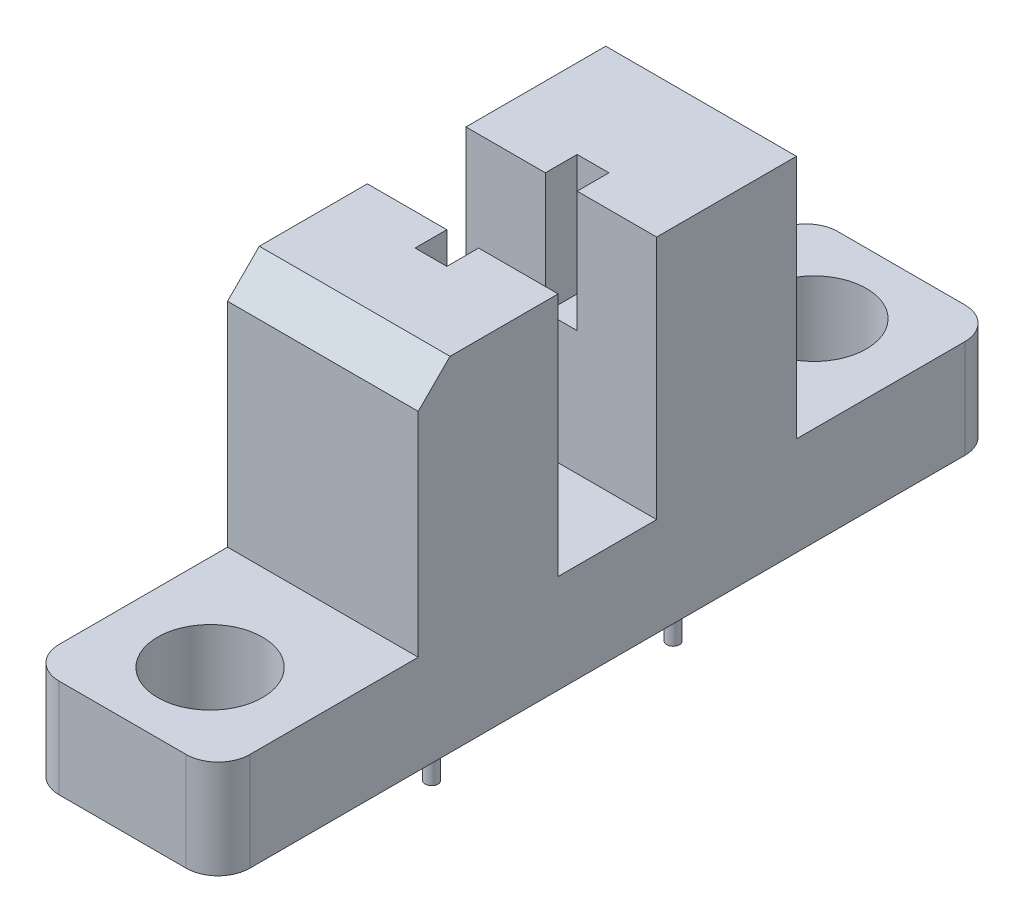
ISO-10303-21;
HEADER;
FILE_DESCRIPTION(('STEP AP214'),'2;1');
FILE_NAME('part.step','',(''),(''),'','','');
FILE_SCHEMA(('AUTOMOTIVE_DESIGN { 1 0 10303 214 1 1 1 1 }'));
ENDSEC;
DATA;
#1=APPLICATION_CONTEXT('core data for automotive mechanical design processes');
#2=APPLICATION_PROTOCOL_DEFINITION('international standard','automotive_design',2000,#1);
#3=PRODUCT_CONTEXT('',#1,'mechanical');
#4=PRODUCT('Part','Part','',(#3));
#5=PRODUCT_RELATED_PRODUCT_CATEGORY('part','',(#4));
#6=PRODUCT_DEFINITION_FORMATION('','',#4);
#7=PRODUCT_DEFINITION_CONTEXT('part definition',#1,'design');
#8=PRODUCT_DEFINITION('design','',#6,#7);
#9=PRODUCT_DEFINITION_SHAPE('','',#8);
#10=(LENGTH_UNIT() NAMED_UNIT(*) SI_UNIT(.MILLI.,.METRE.));
#11=(NAMED_UNIT(*) PLANE_ANGLE_UNIT() SI_UNIT($,.RADIAN.));
#12=(NAMED_UNIT(*) SI_UNIT($,.STERADIAN.) SOLID_ANGLE_UNIT());
#13=UNCERTAINTY_MEASURE_WITH_UNIT(LENGTH_MEASURE(1.E-05),#10,'distance_accuracy_value','');
#14=(GEOMETRIC_REPRESENTATION_CONTEXT(3) GLOBAL_UNCERTAINTY_ASSIGNED_CONTEXT((#13)) GLOBAL_UNIT_ASSIGNED_CONTEXT((#10,
#11,#12)) REPRESENTATION_CONTEXT('',''));
#15=CARTESIAN_POINT('',(0.,0.,0.));
#16=DIRECTION('',(0.,0.,1.));
#17=DIRECTION('',(1.,0.,0.));
#18=AXIS2_PLACEMENT_3D('',#15,#16,#17);
#19=CARTESIAN_POINT('',(3.,-1.55,12.25));
#20=DIRECTION('',(0.,1.,0.));
#21=DIRECTION('',(0.,0.,1.));
#22=AXIS2_PLACEMENT_3D('',#19,#20,#21);
#23=PLANE('',#22);
#24=CARTESIAN_POINT('',(-1.27,-1.55,-3.8));
#25=DIRECTION('',(0.,1.,0.));
#26=DIRECTION('',(0.,0.,1.));
#27=AXIS2_PLACEMENT_3D('',#24,#25,#26);
#28=CIRCLE('',#27,0.2);
#29=CARTESIAN_POINT('',(-1.27,-1.55,-3.6));
#30=VERTEX_POINT('',#29);
#31=EDGE_CURVE('E11',#30,#30,#28,.F.);
#32=ORIENTED_EDGE('',*,*,#31,.F.);
#33=EDGE_LOOP('',(#32));
#34=FACE_BOUND('',#33,.T.);
#35=CARTESIAN_POINT('',(1.27,-1.55,-3.8));
#36=DIRECTION('',(0.,1.,0.));
#37=DIRECTION('',(0.,0.,1.));
#38=AXIS2_PLACEMENT_3D('',#35,#36,#37);
#39=CIRCLE('',#38,0.2);
#40=CARTESIAN_POINT('',(1.27,-1.55,-3.6));
#41=VERTEX_POINT('',#40);
#42=EDGE_CURVE('E46',#41,#41,#39,.F.);
#43=ORIENTED_EDGE('',*,*,#42,.F.);
#44=EDGE_LOOP('',(#43));
#45=FACE_BOUND('',#44,.T.);
#46=CARTESIAN_POINT('',(1.27,-1.55,3.8));
#47=DIRECTION('',(0.,1.,0.));
#48=DIRECTION('',(0.,0.,1.));
#49=AXIS2_PLACEMENT_3D('',#46,#47,#48);
#50=CIRCLE('',#49,0.2);
#51=CARTESIAN_POINT('',(1.27,-1.55,4.));
#52=VERTEX_POINT('',#51);
#53=EDGE_CURVE('E471',#52,#52,#50,.F.);
#54=ORIENTED_EDGE('',*,*,#53,.F.);
#55=EDGE_LOOP('',(#54));
#56=FACE_BOUND('',#55,.T.);
#57=CARTESIAN_POINT('',(-1.27,-1.55,3.8));
#58=DIRECTION('',(0.,1.,0.));
#59=DIRECTION('',(0.,0.,1.));
#60=AXIS2_PLACEMENT_3D('',#57,#58,#59);
#61=CIRCLE('',#60,0.2);
#62=CARTESIAN_POINT('',(-1.27,-1.55,4.));
#63=VERTEX_POINT('',#62);
#64=EDGE_CURVE('E467',#63,#63,#61,.F.);
#65=ORIENTED_EDGE('',*,*,#64,.F.);
#66=EDGE_LOOP('',(#65));
#67=FACE_BOUND('',#66,.T.);
#68=CARTESIAN_POINT('',(0.,-1.55,-9.5));
#69=DIRECTION('',(0.,1.,0.));
#70=DIRECTION('',(0.,0.,1.));
#71=AXIS2_PLACEMENT_3D('',#68,#69,#70);
#72=CIRCLE('',#71,1.65);
#73=CARTESIAN_POINT('',(0.,-1.55,-7.85));
#74=VERTEX_POINT('',#73);
#75=EDGE_CURVE('E288',#74,#74,#72,.F.);
#76=ORIENTED_EDGE('',*,*,#75,.F.);
#77=EDGE_LOOP('',(#76));
#78=FACE_BOUND('',#77,.T.);
#79=CARTESIAN_POINT('',(2.,-1.55,-11.25));
#80=DIRECTION('',(0.,1.,0.));
#81=DIRECTION('',(0.,0.,1.));
#82=AXIS2_PLACEMENT_3D('',#79,#80,#81);
#83=CIRCLE('',#82,1.);
#84=CARTESIAN_POINT('',(2.,-1.55,-12.25));
#85=VERTEX_POINT('',#84);
#86=CARTESIAN_POINT('',(3.,-1.55,-11.25));
#87=VERTEX_POINT('',#86);
#88=EDGE_CURVE('E432',#85,#87,#83,.F.);
#89=ORIENTED_EDGE('',*,*,#88,.T.);
#90=DIRECTION('',(0.,0.,-1.));
#91=VECTOR('',#90,1.);
#92=CARTESIAN_POINT('',(3.,-1.55,12.25));
#93=LINE('',#92,#91);
#94=CARTESIAN_POINT('',(3.,-1.55,11.25));
#95=VERTEX_POINT('',#94);
#96=EDGE_CURVE('E365',#95,#87,#93,.T.);
#97=ORIENTED_EDGE('',*,*,#96,.F.);
#98=CARTESIAN_POINT('',(2.,-1.55,11.25));
#99=DIRECTION('',(0.,1.,0.));
#100=DIRECTION('',(0.,0.,1.));
#101=AXIS2_PLACEMENT_3D('',#98,#99,#100);
#102=CIRCLE('',#101,1.);
#103=CARTESIAN_POINT('',(2.,-1.55,12.25));
#104=VERTEX_POINT('',#103);
#105=EDGE_CURVE('E426',#95,#104,#102,.F.);
#106=ORIENTED_EDGE('',*,*,#105,.T.);
#107=DIRECTION('',(-1.,0.,0.));
#108=VECTOR('',#107,1.);
#109=CARTESIAN_POINT('',(3.,-1.55,12.25));
#110=LINE('',#109,#108);
#111=CARTESIAN_POINT('',(-2.,-1.55,12.25));
#112=VERTEX_POINT('',#111);
#113=EDGE_CURVE('E374',#104,#112,#110,.T.);
#114=ORIENTED_EDGE('',*,*,#113,.T.);
#115=CARTESIAN_POINT('',(-2.,-1.55,11.25));
#116=DIRECTION('',(0.,1.,0.));
#117=DIRECTION('',(0.,0.,1.));
#118=AXIS2_PLACEMENT_3D('',#115,#116,#117);
#119=CIRCLE('',#118,1.);
#120=CARTESIAN_POINT('',(-3.,-1.55,11.25));
#121=VERTEX_POINT('',#120);
#122=EDGE_CURVE('E429',#112,#121,#119,.F.);
#123=ORIENTED_EDGE('',*,*,#122,.T.);
#124=DIRECTION('',(0.,0.,-1.));
#125=VECTOR('',#124,1.);
#126=CARTESIAN_POINT('',(-3.,-1.55,12.25));
#127=LINE('',#126,#125);
#128=CARTESIAN_POINT('',(-3.,-1.55,-11.25));
#129=VERTEX_POINT('',#128);
#130=EDGE_CURVE('E364',#121,#129,#127,.T.);
#131=ORIENTED_EDGE('',*,*,#130,.T.);
#132=CARTESIAN_POINT('',(-2.,-1.55,-11.25));
#133=DIRECTION('',(0.,1.,0.));
#134=DIRECTION('',(0.,0.,1.));
#135=AXIS2_PLACEMENT_3D('',#132,#133,#134);
#136=CIRCLE('',#135,1.);
#137=CARTESIAN_POINT('',(-2.,-1.55,-12.25));
#138=VERTEX_POINT('',#137);
#139=EDGE_CURVE('E436',#129,#138,#136,.F.);
#140=ORIENTED_EDGE('',*,*,#139,.T.);
#141=DIRECTION('',(-1.,0.,0.));
#142=VECTOR('',#141,1.);
#143=CARTESIAN_POINT('',(3.,-1.55,-12.25));
#144=LINE('',#143,#142);
#145=EDGE_CURVE('E394',#85,#138,#144,.T.);
#146=ORIENTED_EDGE('',*,*,#145,.F.);
#147=EDGE_LOOP('',(#89,#97,#106,#114,#123,#131,#140,#146));
#148=FACE_BOUND('',#147,.T.);
#149=CARTESIAN_POINT('',(0.,-1.55,9.5));
#150=DIRECTION('',(0.,1.,0.));
#151=DIRECTION('',(0.,0.,1.));
#152=AXIS2_PLACEMENT_3D('',#149,#150,#151);
#153=CIRCLE('',#152,1.65);
#154=CARTESIAN_POINT('',(0.,-1.55,11.15));
#155=VERTEX_POINT('',#154);
#156=EDGE_CURVE('E284',#155,#155,#153,.T.);
#157=ORIENTED_EDGE('',*,*,#156,.T.);
#158=EDGE_LOOP('',(#157));
#159=FACE_BOUND('',#158,.T.);
#160=ADVANCED_FACE('F37',(#34,#45,#56,#67,#78,#148,#159),#23,.F.);
#161=CARTESIAN_POINT('',(3.,1.55,12.25));
#162=DIRECTION('',(0.,-1.,0.));
#163=DIRECTION('',(0.,0.,-1.));
#164=AXIS2_PLACEMENT_3D('',#161,#162,#163);
#165=PLANE('',#164);
#166=CARTESIAN_POINT('',(0.,1.55,9.5));
#167=DIRECTION('',(0.,1.,0.));
#168=DIRECTION('',(0.,0.,1.));
#169=AXIS2_PLACEMENT_3D('',#166,#167,#168);
#170=CIRCLE('',#169,1.65);
#171=CARTESIAN_POINT('',(0.,1.55,11.15));
#172=VERTEX_POINT('',#171);
#173=EDGE_CURVE('E279',#172,#172,#170,.F.);
#174=ORIENTED_EDGE('',*,*,#173,.T.);
#175=EDGE_LOOP('',(#174));
#176=FACE_BOUND('',#175,.T.);
#177=DIRECTION('',(1.,0.,0.));
#178=VECTOR('',#177,1.);
#179=CARTESIAN_POINT('',(3.,1.55,5.95));
#180=LINE('',#179,#178);
#181=CARTESIAN_POINT('',(-3.,1.55,5.95));
#182=VERTEX_POINT('',#181);
#183=CARTESIAN_POINT('',(3.,1.55,5.95));
#184=VERTEX_POINT('',#183);
#185=EDGE_CURVE('E314',#182,#184,#180,.T.);
#186=ORIENTED_EDGE('',*,*,#185,.F.);
#187=DIRECTION('',(0.,0.,1.));
#188=VECTOR('',#187,1.);
#189=CARTESIAN_POINT('',(-3.,1.55,12.25));
#190=LINE('',#189,#188);
#191=CARTESIAN_POINT('',(-3.,1.55,11.25));
#192=VERTEX_POINT('',#191);
#193=EDGE_CURVE('E378',#182,#192,#190,.T.);
#194=ORIENTED_EDGE('',*,*,#193,.T.);
#195=CARTESIAN_POINT('',(-2.,1.55,11.25));
#196=DIRECTION('',(0.,-1.,0.));
#197=DIRECTION('',(0.,0.,-1.));
#198=AXIS2_PLACEMENT_3D('',#195,#196,#197);
#199=CIRCLE('',#198,1.);
#200=CARTESIAN_POINT('',(-2.,1.55,12.25));
#201=VERTEX_POINT('',#200);
#202=EDGE_CURVE('E409',#192,#201,#199,.F.);
#203=ORIENTED_EDGE('',*,*,#202,.T.);
#204=DIRECTION('',(-1.,0.,0.));
#205=VECTOR('',#204,1.);
#206=CARTESIAN_POINT('',(3.,1.55,12.25));
#207=LINE('',#206,#205);
#208=CARTESIAN_POINT('',(2.,1.55,12.25));
#209=VERTEX_POINT('',#208);
#210=EDGE_CURVE('E386',#209,#201,#207,.T.);
#211=ORIENTED_EDGE('',*,*,#210,.F.);
#212=CARTESIAN_POINT('',(2.,1.55,11.25));
#213=DIRECTION('',(0.,-1.,0.));
#214=DIRECTION('',(0.,0.,-1.));
#215=AXIS2_PLACEMENT_3D('',#212,#213,#214);
#216=CIRCLE('',#215,1.);
#217=CARTESIAN_POINT('',(3.,1.55,11.25));
#218=VERTEX_POINT('',#217);
#219=EDGE_CURVE('E405',#209,#218,#216,.F.);
#220=ORIENTED_EDGE('',*,*,#219,.T.);
#221=DIRECTION('',(0.,0.,1.));
#222=VECTOR('',#221,1.);
#223=CARTESIAN_POINT('',(3.,1.55,12.25));
#224=LINE('',#223,#222);
#225=EDGE_CURVE('E368',#184,#218,#224,.T.);
#226=ORIENTED_EDGE('',*,*,#225,.F.);
#227=EDGE_LOOP('',(#186,#194,#203,#211,#220,#226));
#228=FACE_BOUND('',#227,.T.);
#229=ADVANCED_FACE('F483',(#176,#228),#165,.F.);
#230=CARTESIAN_POINT('',(-3.,1.55,-1.55));
#231=VERTEX_POINT('',#230);
#232=CARTESIAN_POINT('',(-3.,1.55,1.55));
#233=VERTEX_POINT('',#232);
#234=EDGE_CURVE('E382',#231,#233,#190,.T.);
#235=ORIENTED_EDGE('',*,*,#234,.T.);
#236=DIRECTION('',(1.,0.,0.));
#237=VECTOR('',#236,1.);
#238=CARTESIAN_POINT('',(3.,1.55,1.55));
#239=LINE('',#238,#237);
#240=CARTESIAN_POINT('',(3.,1.55,1.55));
#241=VERTEX_POINT('',#240);
#242=EDGE_CURVE('E326',#233,#241,#239,.T.);
#243=ORIENTED_EDGE('',*,*,#242,.T.);
#244=CARTESIAN_POINT('',(3.,1.55,-1.55));
#245=VERTEX_POINT('',#244);
#246=EDGE_CURVE('E375',#245,#241,#224,.T.);
#247=ORIENTED_EDGE('',*,*,#246,.F.);
#248=DIRECTION('',(1.,0.,0.));
#249=VECTOR('',#248,1.);
#250=CARTESIAN_POINT('',(3.,1.55,-1.55));
#251=LINE('',#250,#249);
#252=EDGE_CURVE('E348',#231,#245,#251,.T.);
#253=ORIENTED_EDGE('',*,*,#252,.F.);
#254=EDGE_LOOP('',(#235,#243,#247,#253));
#255=FACE_BOUND('',#254,.T.);
#256=ADVANCED_FACE('F557',(#255),#165,.F.);
#257=CARTESIAN_POINT('',(3.,1.55,-12.25));
#258=DIRECTION('',(0.,0.,1.));
#259=DIRECTION('',(1.,0.,0.));
#260=AXIS2_PLACEMENT_3D('',#257,#258,#259);
#261=PLANE('',#260);
#262=ORIENTED_EDGE('',*,*,#145,.T.);
#263=DIRECTION('',(0.,1.,0.));
#264=VECTOR('',#263,1.);
#265=CARTESIAN_POINT('',(-2.,1.55,-12.25));
#266=LINE('',#265,#264);
#267=CARTESIAN_POINT('',(-2.,1.55,-12.25));
#268=VERTEX_POINT('',#267);
#269=EDGE_CURVE('E401',#138,#268,#266,.T.);
#270=ORIENTED_EDGE('',*,*,#269,.T.);
#271=DIRECTION('',(-1.,0.,0.));
#272=VECTOR('',#271,1.);
#273=CARTESIAN_POINT('',(3.,1.55,-12.25));
#274=LINE('',#273,#272);
#275=CARTESIAN_POINT('',(2.,1.55,-12.25));
#276=VERTEX_POINT('',#275);
#277=EDGE_CURVE('E390',#276,#268,#274,.T.);
#278=ORIENTED_EDGE('',*,*,#277,.F.);
#279=DIRECTION('',(0.,1.,0.));
#280=VECTOR('',#279,1.);
#281=CARTESIAN_POINT('',(2.,1.55,-12.25));
#282=LINE('',#281,#280);
#283=EDGE_CURVE('E398',#276,#85,#282,.F.);
#284=ORIENTED_EDGE('',*,*,#283,.T.);
#285=EDGE_LOOP('',(#262,#270,#278,#284));
#286=FACE_BOUND('',#285,.T.);
#287=ADVANCED_FACE('F555',(#286),#261,.F.);
#288=CARTESIAN_POINT('',(0.,1.55,-9.5));
#289=DIRECTION('',(0.,1.,0.));
#290=DIRECTION('',(0.,0.,1.));
#291=AXIS2_PLACEMENT_3D('',#288,#289,#290);
#292=CIRCLE('',#291,1.65);
#293=CARTESIAN_POINT('',(0.,1.55,-7.85));
#294=VERTEX_POINT('',#293);
#295=EDGE_CURVE('E289',#294,#294,#292,.T.);
#296=ORIENTED_EDGE('',*,*,#295,.F.);
#297=EDGE_LOOP('',(#296));
#298=FACE_BOUND('',#297,.T.);
#299=CARTESIAN_POINT('',(-3.,1.55,-11.25));
#300=VERTEX_POINT('',#299);
#301=CARTESIAN_POINT('',(-3.,1.55,-5.95));
#302=VERTEX_POINT('',#301);
#303=EDGE_CURVE('E369',#300,#302,#190,.T.);
#304=ORIENTED_EDGE('',*,*,#303,.T.);
#305=DIRECTION('',(1.,0.,0.));
#306=VECTOR('',#305,1.);
#307=CARTESIAN_POINT('',(3.,1.55,-5.95));
#308=LINE('',#307,#306);
#309=CARTESIAN_POINT('',(3.,1.55,-5.95));
#310=VERTEX_POINT('',#309);
#311=EDGE_CURVE('E360',#302,#310,#308,.T.);
#312=ORIENTED_EDGE('',*,*,#311,.T.);
#313=CARTESIAN_POINT('',(3.,1.55,-11.25));
#314=VERTEX_POINT('',#313);
#315=EDGE_CURVE('E370',#314,#310,#224,.T.);
#316=ORIENTED_EDGE('',*,*,#315,.F.);
#317=CARTESIAN_POINT('',(2.,1.55,-11.25));
#318=DIRECTION('',(0.,-1.,0.));
#319=DIRECTION('',(0.,0.,-1.));
#320=AXIS2_PLACEMENT_3D('',#317,#318,#319);
#321=CIRCLE('',#320,1.);
#322=EDGE_CURVE('E412',#314,#276,#321,.F.);
#323=ORIENTED_EDGE('',*,*,#322,.T.);
#324=ORIENTED_EDGE('',*,*,#277,.T.);
#325=CARTESIAN_POINT('',(-2.,1.55,-11.25));
#326=DIRECTION('',(0.,-1.,0.));
#327=DIRECTION('',(0.,0.,-1.));
#328=AXIS2_PLACEMENT_3D('',#325,#326,#327);
#329=CIRCLE('',#328,1.);
#330=EDGE_CURVE('E415',#268,#300,#329,.F.);
#331=ORIENTED_EDGE('',*,*,#330,.T.);
#332=EDGE_LOOP('',(#304,#312,#316,#323,#324,#331));
#333=FACE_BOUND('',#332,.T.);
#334=ADVANCED_FACE('F551',(#298,#333),#165,.F.);
#335=CARTESIAN_POINT('',(3.,1.55,12.25));
#336=DIRECTION('',(0.,0.,-1.));
#337=DIRECTION('',(-1.,0.,0.));
#338=AXIS2_PLACEMENT_3D('',#335,#336,#337);
#339=PLANE('',#338);
#340=ORIENTED_EDGE('',*,*,#210,.T.);
#341=DIRECTION('',(0.,-1.,0.));
#342=VECTOR('',#341,1.);
#343=CARTESIAN_POINT('',(-2.,-1.55,12.25));
#344=LINE('',#343,#342);
#345=EDGE_CURVE('E450',#201,#112,#344,.T.);
#346=ORIENTED_EDGE('',*,*,#345,.T.);
#347=ORIENTED_EDGE('',*,*,#113,.F.);
#348=DIRECTION('',(0.,-1.,0.));
#349=VECTOR('',#348,1.);
#350=CARTESIAN_POINT('',(2.,1.55,12.25));
#351=LINE('',#350,#349);
#352=EDGE_CURVE('E447',#104,#209,#351,.F.);
#353=ORIENTED_EDGE('',*,*,#352,.T.);
#354=EDGE_LOOP('',(#340,#346,#347,#353));
#355=FACE_BOUND('',#354,.T.);
#356=ADVANCED_FACE('F543',(#355),#339,.F.);
#357=CARTESIAN_POINT('',(3.,0.,0.));
#358=DIRECTION('',(-1.,0.,0.));
#359=DIRECTION('',(0.,0.,1.));
#360=AXIS2_PLACEMENT_3D('',#357,#358,#359);
#361=PLANE('',#360);
#362=DIRECTION('',(0.,0.,-1.));
#363=VECTOR('',#362,1.);
#364=CARTESIAN_POINT('',(3.,9.25,12.25));
#365=LINE('',#364,#363);
#366=CARTESIAN_POINT('',(3.,9.25,4.95));
#367=VERTEX_POINT('',#366);
#368=CARTESIAN_POINT('',(3.,9.25,1.55));
#369=VERTEX_POINT('',#368);
#370=EDGE_CURVE('E301',#367,#369,#365,.T.);
#371=ORIENTED_EDGE('',*,*,#370,.F.);
#372=DIRECTION('',(0.,-0.707106781186549,0.707106781186546));
#373=VECTOR('',#372,1.);
#374=CARTESIAN_POINT('',(3.,9.25,4.95));
#375=LINE('',#374,#373);
#376=CARTESIAN_POINT('',(3.,8.24999999999999,5.95));
#377=VERTEX_POINT('',#376);
#378=EDGE_CURVE('E458',#367,#377,#375,.T.);
#379=ORIENTED_EDGE('',*,*,#378,.T.);
#380=DIRECTION('',(0.,-1.,0.));
#381=VECTOR('',#380,1.);
#382=CARTESIAN_POINT('',(3.,9.25,5.95));
#383=LINE('',#382,#381);
#384=EDGE_CURVE('E318',#377,#184,#383,.T.);
#385=ORIENTED_EDGE('',*,*,#384,.T.);
#386=ORIENTED_EDGE('',*,*,#225,.T.);
#387=DIRECTION('',(0.,-1.,0.));
#388=VECTOR('',#387,1.);
#389=CARTESIAN_POINT('',(3.,0.,11.25));
#390=LINE('',#389,#388);
#391=EDGE_CURVE('E439',#218,#95,#390,.T.);
#392=ORIENTED_EDGE('',*,*,#391,.T.);
#393=ORIENTED_EDGE('',*,*,#96,.T.);
#394=DIRECTION('',(0.,1.,0.));
#395=VECTOR('',#394,1.);
#396=CARTESIAN_POINT('',(3.,0.,-11.25));
#397=LINE('',#396,#395);
#398=EDGE_CURVE('E443',#87,#314,#397,.T.);
#399=ORIENTED_EDGE('',*,*,#398,.T.);
#400=ORIENTED_EDGE('',*,*,#315,.T.);
#401=DIRECTION('',(0.,-1.,0.));
#402=VECTOR('',#401,1.);
#403=CARTESIAN_POINT('',(3.,9.25,-5.95));
#404=LINE('',#403,#402);
#405=CARTESIAN_POINT('',(3.,9.25,-5.95));
#406=VERTEX_POINT('',#405);
#407=EDGE_CURVE('E343',#406,#310,#404,.T.);
#408=ORIENTED_EDGE('',*,*,#407,.F.);
#409=DIRECTION('',(0.,0.,-1.));
#410=VECTOR('',#409,1.);
#411=CARTESIAN_POINT('',(3.,9.25,12.25));
#412=LINE('',#411,#410);
#413=CARTESIAN_POINT('',(3.,9.25,-1.55));
#414=VERTEX_POINT('',#413);
#415=EDGE_CURVE('E334',#414,#406,#412,.T.);
#416=ORIENTED_EDGE('',*,*,#415,.F.);
#417=DIRECTION('',(0.,-1.,0.));
#418=VECTOR('',#417,1.);
#419=CARTESIAN_POINT('',(3.,9.25,-1.55));
#420=LINE('',#419,#418);
#421=EDGE_CURVE('E352',#414,#245,#420,.T.);
#422=ORIENTED_EDGE('',*,*,#421,.T.);
#423=ORIENTED_EDGE('',*,*,#246,.T.);
#424=DIRECTION('',(0.,-1.,0.));
#425=VECTOR('',#424,1.);
#426=CARTESIAN_POINT('',(3.,9.25,1.55));
#427=LINE('',#426,#425);
#428=EDGE_CURVE('E309',#369,#241,#427,.T.);
#429=ORIENTED_EDGE('',*,*,#428,.F.);
#430=EDGE_LOOP('',(#371,#379,#385,#386,#392,#393,#399,#400,#408,#416,#422,#423,#429));
#431=FACE_BOUND('',#430,.T.);
#432=ADVANCED_FACE('F539',(#431),#361,.F.);
#433=CARTESIAN_POINT('',(-3.,0.,0.));
#434=DIRECTION('',(-1.,0.,0.));
#435=DIRECTION('',(0.,0.,1.));
#436=AXIS2_PLACEMENT_3D('',#433,#434,#435);
#437=PLANE('',#436);
#438=DIRECTION('',(0.,-1.,0.));
#439=VECTOR('',#438,1.);
#440=CARTESIAN_POINT('',(-3.,9.25,5.95));
#441=LINE('',#440,#439);
#442=CARTESIAN_POINT('',(-3.,8.24999999999999,5.95));
#443=VERTEX_POINT('',#442);
#444=EDGE_CURVE('E315',#443,#182,#441,.T.);
#445=ORIENTED_EDGE('',*,*,#444,.F.);
#446=DIRECTION('',(0.,0.707106781186549,-0.707106781186546));
#447=VECTOR('',#446,1.);
#448=CARTESIAN_POINT('',(-3.,7.09999999999999,7.10000000000001));
#449=LINE('',#448,#447);
#450=CARTESIAN_POINT('',(-3.,9.25,4.95));
#451=VERTEX_POINT('',#450);
#452=EDGE_CURVE('E464',#443,#451,#449,.T.);
#453=ORIENTED_EDGE('',*,*,#452,.T.);
#454=DIRECTION('',(0.,0.,1.));
#455=VECTOR('',#454,1.);
#456=CARTESIAN_POINT('',(-3.,9.25,12.25));
#457=LINE('',#456,#455);
#458=CARTESIAN_POINT('',(-3.,9.25,1.55));
#459=VERTEX_POINT('',#458);
#460=EDGE_CURVE('E305',#459,#451,#457,.T.);
#461=ORIENTED_EDGE('',*,*,#460,.F.);
#462=DIRECTION('',(0.,-1.,0.));
#463=VECTOR('',#462,1.);
#464=CARTESIAN_POINT('',(-3.,9.25,1.55));
#465=LINE('',#464,#463);
#466=EDGE_CURVE('E310',#459,#233,#465,.T.);
#467=ORIENTED_EDGE('',*,*,#466,.T.);
#468=ORIENTED_EDGE('',*,*,#234,.F.);
#469=DIRECTION('',(0.,-1.,0.));
#470=VECTOR('',#469,1.);
#471=CARTESIAN_POINT('',(-3.,9.25,-1.55));
#472=LINE('',#471,#470);
#473=CARTESIAN_POINT('',(-3.,9.25,-1.55));
#474=VERTEX_POINT('',#473);
#475=EDGE_CURVE('E349',#474,#231,#472,.T.);
#476=ORIENTED_EDGE('',*,*,#475,.F.);
#477=DIRECTION('',(0.,0.,1.));
#478=VECTOR('',#477,1.);
#479=CARTESIAN_POINT('',(-3.,9.25,12.25));
#480=LINE('',#479,#478);
#481=CARTESIAN_POINT('',(-3.,9.25,-5.95));
#482=VERTEX_POINT('',#481);
#483=EDGE_CURVE('E340',#482,#474,#480,.T.);
#484=ORIENTED_EDGE('',*,*,#483,.F.);
#485=DIRECTION('',(0.,-1.,0.));
#486=VECTOR('',#485,1.);
#487=CARTESIAN_POINT('',(-3.,9.25,-5.95));
#488=LINE('',#487,#486);
#489=EDGE_CURVE('E344',#482,#302,#488,.T.);
#490=ORIENTED_EDGE('',*,*,#489,.T.);
#491=ORIENTED_EDGE('',*,*,#303,.F.);
#492=DIRECTION('',(0.,1.,0.));
#493=VECTOR('',#492,1.);
#494=CARTESIAN_POINT('',(-3.,-1.55,-11.25));
#495=LINE('',#494,#493);
#496=EDGE_CURVE('E422',#300,#129,#495,.F.);
#497=ORIENTED_EDGE('',*,*,#496,.T.);
#498=ORIENTED_EDGE('',*,*,#130,.F.);
#499=DIRECTION('',(0.,-1.,0.));
#500=VECTOR('',#499,1.);
#501=CARTESIAN_POINT('',(-3.,1.55,11.25));
#502=LINE('',#501,#500);
#503=EDGE_CURVE('E418',#121,#192,#502,.F.);
#504=ORIENTED_EDGE('',*,*,#503,.T.);
#505=ORIENTED_EDGE('',*,*,#193,.F.);
#506=EDGE_LOOP('',(#445,#453,#461,#467,#468,#476,#484,#490,#491,#497,#498,#504,#505));
#507=FACE_BOUND('',#506,.T.);
#508=ADVANCED_FACE('F542',(#507),#437,.T.);
#509=CARTESIAN_POINT('',(-2.,1.55,-11.25));
#510=DIRECTION('',(0.,-1.,0.));
#511=DIRECTION('',(0.,0.,-1.));
#512=AXIS2_PLACEMENT_3D('',#509,#510,#511);
#513=CYLINDRICAL_SURFACE('',#512,1.);
#514=ORIENTED_EDGE('',*,*,#139,.F.);
#515=ORIENTED_EDGE('',*,*,#496,.F.);
#516=ORIENTED_EDGE('',*,*,#330,.F.);
#517=ORIENTED_EDGE('',*,*,#269,.F.);
#518=EDGE_LOOP('',(#514,#515,#516,#517));
#519=FACE_BOUND('',#518,.T.);
#520=ADVANCED_FACE('F547',(#519),#513,.T.);
#521=CARTESIAN_POINT('',(2.,0.,-11.25));
#522=DIRECTION('',(0.,1.,0.));
#523=DIRECTION('',(0.,0.,1.));
#524=AXIS2_PLACEMENT_3D('',#521,#522,#523);
#525=CYLINDRICAL_SURFACE('',#524,1.);
#526=ORIENTED_EDGE('',*,*,#88,.F.);
#527=ORIENTED_EDGE('',*,*,#283,.F.);
#528=ORIENTED_EDGE('',*,*,#322,.F.);
#529=ORIENTED_EDGE('',*,*,#398,.F.);
#530=EDGE_LOOP('',(#526,#527,#528,#529));
#531=FACE_BOUND('',#530,.T.);
#532=ADVANCED_FACE('F563',(#531),#525,.T.);
#533=CARTESIAN_POINT('',(-2.,1.55,11.25));
#534=DIRECTION('',(0.,1.,0.));
#535=DIRECTION('',(0.,0.,1.));
#536=AXIS2_PLACEMENT_3D('',#533,#534,#535);
#537=CYLINDRICAL_SURFACE('',#536,1.);
#538=ORIENTED_EDGE('',*,*,#202,.F.);
#539=ORIENTED_EDGE('',*,*,#503,.F.);
#540=ORIENTED_EDGE('',*,*,#122,.F.);
#541=ORIENTED_EDGE('',*,*,#345,.F.);
#542=EDGE_LOOP('',(#538,#539,#540,#541));
#543=FACE_BOUND('',#542,.T.);
#544=ADVANCED_FACE('F567',(#543),#537,.T.);
#545=CARTESIAN_POINT('',(2.,0.,11.25));
#546=DIRECTION('',(0.,-1.,0.));
#547=DIRECTION('',(0.,0.,-1.));
#548=AXIS2_PLACEMENT_3D('',#545,#546,#547);
#549=CYLINDRICAL_SURFACE('',#548,1.);
#550=ORIENTED_EDGE('',*,*,#219,.F.);
#551=ORIENTED_EDGE('',*,*,#352,.F.);
#552=ORIENTED_EDGE('',*,*,#105,.F.);
#553=ORIENTED_EDGE('',*,*,#391,.F.);
#554=EDGE_LOOP('',(#550,#551,#552,#553));
#555=FACE_BOUND('',#554,.T.);
#556=ADVANCED_FACE('F537',(#555),#549,.T.);
#557=CARTESIAN_POINT('',(3.,9.25,-5.95));
#558=DIRECTION('',(0.,0.,-1.));
#559=DIRECTION('',(0.,1.,0.));
#560=AXIS2_PLACEMENT_3D('',#557,#558,#559);
#561=PLANE('',#560);
#562=ORIENTED_EDGE('',*,*,#311,.F.);
#563=ORIENTED_EDGE('',*,*,#489,.F.);
#564=DIRECTION('',(1.,0.,0.));
#565=VECTOR('',#564,1.);
#566=CARTESIAN_POINT('',(3.,9.25,-5.95));
#567=LINE('',#566,#565);
#568=EDGE_CURVE('E330',#482,#406,#567,.T.);
#569=ORIENTED_EDGE('',*,*,#568,.T.);
#570=ORIENTED_EDGE('',*,*,#407,.T.);
#571=EDGE_LOOP('',(#562,#563,#569,#570));
#572=FACE_BOUND('',#571,.T.);
#573=ADVANCED_FACE('F534',(#572),#561,.T.);
#574=CARTESIAN_POINT('',(3.,9.25,-1.55));
#575=DIRECTION('',(0.,0.,-1.));
#576=DIRECTION('',(0.,1.,0.));
#577=AXIS2_PLACEMENT_3D('',#574,#575,#576);
#578=PLANE('',#577);
#579=DIRECTION('',(1.,0.,0.));
#580=VECTOR('',#579,1.);
#581=CARTESIAN_POINT('',(-0.5,5.45,-1.55));
#582=LINE('',#581,#580);
#583=CARTESIAN_POINT('',(-0.5,5.45,-1.55));
#584=VERTEX_POINT('',#583);
#585=CARTESIAN_POINT('',(0.5,5.45,-1.55));
#586=VERTEX_POINT('',#585);
#587=EDGE_CURVE('E213',#584,#586,#582,.T.);
#588=ORIENTED_EDGE('',*,*,#587,.F.);
#589=DIRECTION('',(0.,1.,0.));
#590=VECTOR('',#589,1.);
#591=CARTESIAN_POINT('',(-0.5,5.45,-1.55));
#592=LINE('',#591,#590);
#593=CARTESIAN_POINT('',(-0.5,9.25,-1.55));
#594=VERTEX_POINT('',#593);
#595=EDGE_CURVE('E293',#584,#594,#592,.T.);
#596=ORIENTED_EDGE('',*,*,#595,.T.);
#597=DIRECTION('',(1.,0.,0.));
#598=VECTOR('',#597,1.);
#599=CARTESIAN_POINT('',(3.,9.25,-1.55));
#600=LINE('',#599,#598);
#601=EDGE_CURVE('E336',#474,#594,#600,.T.);
#602=ORIENTED_EDGE('',*,*,#601,.F.);
#603=ORIENTED_EDGE('',*,*,#475,.T.);
#604=ORIENTED_EDGE('',*,*,#252,.T.);
#605=ORIENTED_EDGE('',*,*,#421,.F.);
#606=CARTESIAN_POINT('',(0.5,9.25,-1.55));
#607=VERTEX_POINT('',#606);
#608=EDGE_CURVE('E228',#607,#414,#600,.T.);
#609=ORIENTED_EDGE('',*,*,#608,.F.);
#610=DIRECTION('',(0.,1.,0.));
#611=VECTOR('',#610,1.);
#612=CARTESIAN_POINT('',(0.5,5.45,-1.55));
#613=LINE('',#612,#611);
#614=EDGE_CURVE('E53',#586,#607,#613,.T.);
#615=ORIENTED_EDGE('',*,*,#614,.F.);
#616=EDGE_LOOP('',(#588,#596,#602,#603,#604,#605,#609,#615));
#617=FACE_BOUND('',#616,.T.);
#618=ADVANCED_FACE('F226',(#617),#578,.F.);
#619=CARTESIAN_POINT('',(0.,9.25,0.));
#620=DIRECTION('',(0.,1.,0.));
#621=DIRECTION('',(0.,0.,1.));
#622=AXIS2_PLACEMENT_3D('',#619,#620,#621);
#623=PLANE('',#622);
#624=DIRECTION('',(0.,0.,1.));
#625=VECTOR('',#624,1.);
#626=CARTESIAN_POINT('',(-0.5,9.25,-1.55));
#627=LINE('',#626,#625);
#628=CARTESIAN_POINT('',(-0.5,9.25,-2.55));
#629=VERTEX_POINT('',#628);
#630=EDGE_CURVE('E223',#629,#594,#627,.T.);
#631=ORIENTED_EDGE('',*,*,#630,.F.);
#632=DIRECTION('',(-1.,0.,0.));
#633=VECTOR('',#632,1.);
#634=CARTESIAN_POINT('',(-0.5,9.25,-2.55));
#635=LINE('',#634,#633);
#636=CARTESIAN_POINT('',(0.5,9.25,-2.55));
#637=VERTEX_POINT('',#636);
#638=EDGE_CURVE('E709',#637,#629,#635,.T.);
#639=ORIENTED_EDGE('',*,*,#638,.F.);
#640=DIRECTION('',(0.,0.,-1.));
#641=VECTOR('',#640,1.);
#642=CARTESIAN_POINT('',(0.5,9.25,-2.55));
#643=LINE('',#642,#641);
#644=EDGE_CURVE('E269',#607,#637,#643,.T.);
#645=ORIENTED_EDGE('',*,*,#644,.F.);
#646=ORIENTED_EDGE('',*,*,#608,.T.);
#647=ORIENTED_EDGE('',*,*,#415,.T.);
#648=ORIENTED_EDGE('',*,*,#568,.F.);
#649=ORIENTED_EDGE('',*,*,#483,.T.);
#650=ORIENTED_EDGE('',*,*,#601,.T.);
#651=EDGE_LOOP('',(#631,#639,#645,#646,#647,#648,#649,#650));
#652=FACE_BOUND('',#651,.T.);
#653=ADVANCED_FACE('F527',(#652),#623,.T.);
#654=CARTESIAN_POINT('',(3.,9.25,1.55));
#655=DIRECTION('',(0.,0.,-1.));
#656=DIRECTION('',(0.,1.,0.));
#657=AXIS2_PLACEMENT_3D('',#654,#655,#656);
#658=PLANE('',#657);
#659=DIRECTION('',(0.,1.,0.));
#660=VECTOR('',#659,1.);
#661=CARTESIAN_POINT('',(-0.5,5.45,1.55));
#662=LINE('',#661,#660);
#663=CARTESIAN_POINT('',(-0.5,5.45,1.55));
#664=VERTEX_POINT('',#663);
#665=CARTESIAN_POINT('',(-0.5,9.25,1.55));
#666=VERTEX_POINT('',#665);
#667=EDGE_CURVE('E266',#664,#666,#662,.T.);
#668=ORIENTED_EDGE('',*,*,#667,.F.);
#669=DIRECTION('',(-1.,0.,0.));
#670=VECTOR('',#669,1.);
#671=CARTESIAN_POINT('',(-0.5,5.45,1.55));
#672=LINE('',#671,#670);
#673=CARTESIAN_POINT('',(0.5,5.45,1.55));
#674=VERTEX_POINT('',#673);
#675=EDGE_CURVE('E253',#674,#664,#672,.T.);
#676=ORIENTED_EDGE('',*,*,#675,.F.);
#677=DIRECTION('',(0.,1.,0.));
#678=VECTOR('',#677,1.);
#679=CARTESIAN_POINT('',(0.5,5.45,1.55));
#680=LINE('',#679,#678);
#681=CARTESIAN_POINT('',(0.5,9.25,1.55));
#682=VERTEX_POINT('',#681);
#683=EDGE_CURVE('E270',#674,#682,#680,.T.);
#684=ORIENTED_EDGE('',*,*,#683,.T.);
#685=DIRECTION('',(1.,0.,0.));
#686=VECTOR('',#685,1.);
#687=CARTESIAN_POINT('',(3.,9.25,1.55));
#688=LINE('',#687,#686);
#689=EDGE_CURVE('E283',#682,#369,#688,.T.);
#690=ORIENTED_EDGE('',*,*,#689,.T.);
#691=ORIENTED_EDGE('',*,*,#428,.T.);
#692=ORIENTED_EDGE('',*,*,#242,.F.);
#693=ORIENTED_EDGE('',*,*,#466,.F.);
#694=EDGE_CURVE('E297',#459,#666,#688,.T.);
#695=ORIENTED_EDGE('',*,*,#694,.T.);
#696=EDGE_LOOP('',(#668,#676,#684,#690,#691,#692,#693,#695));
#697=FACE_BOUND('',#696,.T.);
#698=ADVANCED_FACE('F523',(#697),#658,.T.);
#699=CARTESIAN_POINT('',(3.,9.25,5.95));
#700=DIRECTION('',(0.,0.,-1.));
#701=DIRECTION('',(0.,1.,0.));
#702=AXIS2_PLACEMENT_3D('',#699,#700,#701);
#703=PLANE('',#702);
#704=ORIENTED_EDGE('',*,*,#384,.F.);
#705=DIRECTION('',(-1.,0.,0.));
#706=VECTOR('',#705,1.);
#707=CARTESIAN_POINT('',(-3.,8.24999999999999,5.95));
#708=LINE('',#707,#706);
#709=EDGE_CURVE('E461',#377,#443,#708,.T.);
#710=ORIENTED_EDGE('',*,*,#709,.T.);
#711=ORIENTED_EDGE('',*,*,#444,.T.);
#712=ORIENTED_EDGE('',*,*,#185,.T.);
#713=EDGE_LOOP('',(#704,#710,#711,#712));
#714=FACE_BOUND('',#713,.T.);
#715=ADVANCED_FACE('F519',(#714),#703,.F.);
#716=CARTESIAN_POINT('',(0.,9.25,0.));
#717=DIRECTION('',(0.,1.,0.));
#718=DIRECTION('',(0.,0.,1.));
#719=AXIS2_PLACEMENT_3D('',#716,#717,#718);
#720=PLANE('',#719);
#721=DIRECTION('',(0.,0.,1.));
#722=VECTOR('',#721,1.);
#723=CARTESIAN_POINT('',(-0.5,9.25,1.55));
#724=LINE('',#723,#722);
#725=CARTESIAN_POINT('',(-0.5,9.25,2.55));
#726=VERTEX_POINT('',#725);
#727=EDGE_CURVE('E61',#666,#726,#724,.T.);
#728=ORIENTED_EDGE('',*,*,#727,.F.);
#729=ORIENTED_EDGE('',*,*,#694,.F.);
#730=ORIENTED_EDGE('',*,*,#460,.T.);
#731=DIRECTION('',(1.,0.,0.));
#732=VECTOR('',#731,1.);
#733=CARTESIAN_POINT('',(3.,9.25,4.95));
#734=LINE('',#733,#732);
#735=EDGE_CURVE('E454',#451,#367,#734,.T.);
#736=ORIENTED_EDGE('',*,*,#735,.T.);
#737=ORIENTED_EDGE('',*,*,#370,.T.);
#738=ORIENTED_EDGE('',*,*,#689,.F.);
#739=DIRECTION('',(0.,0.,-1.));
#740=VECTOR('',#739,1.);
#741=CARTESIAN_POINT('',(0.5,9.25,2.55));
#742=LINE('',#741,#740);
#743=CARTESIAN_POINT('',(0.5,9.25,2.55));
#744=VERTEX_POINT('',#743);
#745=EDGE_CURVE('E245',#744,#682,#742,.T.);
#746=ORIENTED_EDGE('',*,*,#745,.F.);
#747=DIRECTION('',(1.,0.,0.));
#748=VECTOR('',#747,1.);
#749=CARTESIAN_POINT('',(-0.5,9.25,2.55));
#750=LINE('',#749,#748);
#751=EDGE_CURVE('E260',#726,#744,#750,.T.);
#752=ORIENTED_EDGE('',*,*,#751,.F.);
#753=EDGE_LOOP('',(#728,#729,#730,#736,#737,#738,#746,#752));
#754=FACE_BOUND('',#753,.T.);
#755=ADVANCED_FACE('F510',(#754),#720,.T.);
#756=CARTESIAN_POINT('',(0.,-1.551,-9.5));
#757=DIRECTION('',(0.,1.,0.));
#758=DIRECTION('',(0.,0.,1.));
#759=AXIS2_PLACEMENT_3D('',#756,#757,#758);
#760=CYLINDRICAL_SURFACE('',#759,1.65);
#761=ORIENTED_EDGE('',*,*,#295,.T.);
#762=EDGE_LOOP('',(#761));
#763=FACE_BOUND('',#762,.T.);
#764=ORIENTED_EDGE('',*,*,#75,.T.);
#765=EDGE_LOOP('',(#764));
#766=FACE_BOUND('',#765,.T.);
#767=ADVANCED_FACE('F501',(#763,#766),#760,.F.);
#768=CARTESIAN_POINT('',(0.,-1.55100000000001,9.5));
#769=DIRECTION('',(0.,1.,0.));
#770=DIRECTION('',(0.,0.,1.));
#771=AXIS2_PLACEMENT_3D('',#768,#769,#770);
#772=CYLINDRICAL_SURFACE('',#771,1.65);
#773=ORIENTED_EDGE('',*,*,#173,.F.);
#774=EDGE_LOOP('',(#773));
#775=FACE_BOUND('',#774,.T.);
#776=ORIENTED_EDGE('',*,*,#156,.F.);
#777=EDGE_LOOP('',(#776));
#778=FACE_BOUND('',#777,.T.);
#779=ADVANCED_FACE('F499',(#775,#778),#772,.F.);
#780=CARTESIAN_POINT('',(0.,9.25,4.95));
#781=DIRECTION('',(0.,0.707106781186546,0.707106781186549));
#782=DIRECTION('',(-1.,0.,0.));
#783=AXIS2_PLACEMENT_3D('',#780,#781,#782);
#784=PLANE('',#783);
#785=ORIENTED_EDGE('',*,*,#452,.F.);
#786=ORIENTED_EDGE('',*,*,#709,.F.);
#787=ORIENTED_EDGE('',*,*,#378,.F.);
#788=ORIENTED_EDGE('',*,*,#735,.F.);
#789=EDGE_LOOP('',(#785,#786,#787,#788));
#790=FACE_BOUND('',#789,.T.);
#791=ADVANCED_FACE('F39',(#790),#784,.T.);
#792=CARTESIAN_POINT('',(-0.5,5.45,1.55));
#793=DIRECTION('',(-1.,0.,0.));
#794=DIRECTION('',(0.,0.,1.));
#795=AXIS2_PLACEMENT_3D('',#792,#793,#794);
#796=PLANE('',#795);
#797=ORIENTED_EDGE('',*,*,#727,.T.);
#798=DIRECTION('',(0.,1.,0.));
#799=VECTOR('',#798,1.);
#800=CARTESIAN_POINT('',(-0.5,5.45,2.55));
#801=LINE('',#800,#799);
#802=CARTESIAN_POINT('',(-0.5,5.45,2.55));
#803=VERTEX_POINT('',#802);
#804=EDGE_CURVE('E257',#803,#726,#801,.T.);
#805=ORIENTED_EDGE('',*,*,#804,.F.);
#806=DIRECTION('',(0.,0.,1.));
#807=VECTOR('',#806,1.);
#808=CARTESIAN_POINT('',(-0.5,5.45,1.55));
#809=LINE('',#808,#807);
#810=EDGE_CURVE('E240',#664,#803,#809,.T.);
#811=ORIENTED_EDGE('',*,*,#810,.F.);
#812=ORIENTED_EDGE('',*,*,#667,.T.);
#813=EDGE_LOOP('',(#797,#805,#811,#812));
#814=FACE_BOUND('',#813,.T.);
#815=ADVANCED_FACE('F508',(#814),#796,.F.);
#816=CARTESIAN_POINT('',(0.5,5.45,2.55));
#817=DIRECTION('',(1.,0.,0.));
#818=DIRECTION('',(0.,0.,-1.));
#819=AXIS2_PLACEMENT_3D('',#816,#817,#818);
#820=PLANE('',#819);
#821=ORIENTED_EDGE('',*,*,#745,.T.);
#822=ORIENTED_EDGE('',*,*,#683,.F.);
#823=DIRECTION('',(0.,0.,-1.));
#824=VECTOR('',#823,1.);
#825=CARTESIAN_POINT('',(0.5,5.45,2.55));
#826=LINE('',#825,#824);
#827=CARTESIAN_POINT('',(0.5,5.45,2.55));
#828=VERTEX_POINT('',#827);
#829=EDGE_CURVE('E249',#828,#674,#826,.T.);
#830=ORIENTED_EDGE('',*,*,#829,.F.);
#831=DIRECTION('',(0.,1.,0.));
#832=VECTOR('',#831,1.);
#833=CARTESIAN_POINT('',(0.5,5.45,2.55));
#834=LINE('',#833,#832);
#835=EDGE_CURVE('E274',#828,#744,#834,.T.);
#836=ORIENTED_EDGE('',*,*,#835,.T.);
#837=EDGE_LOOP('',(#821,#822,#830,#836));
#838=FACE_BOUND('',#837,.T.);
#839=ADVANCED_FACE('F635',(#838),#820,.F.);
#840=CARTESIAN_POINT('',(-0.5,5.45,2.55));
#841=DIRECTION('',(0.,0.,1.));
#842=DIRECTION('',(0.,-1.,0.));
#843=AXIS2_PLACEMENT_3D('',#840,#841,#842);
#844=PLANE('',#843);
#845=ORIENTED_EDGE('',*,*,#751,.T.);
#846=ORIENTED_EDGE('',*,*,#835,.F.);
#847=DIRECTION('',(1.,0.,0.));
#848=VECTOR('',#847,1.);
#849=CARTESIAN_POINT('',(-0.5,5.45,2.55));
#850=LINE('',#849,#848);
#851=EDGE_CURVE('E244',#803,#828,#850,.T.);
#852=ORIENTED_EDGE('',*,*,#851,.F.);
#853=ORIENTED_EDGE('',*,*,#804,.T.);
#854=EDGE_LOOP('',(#845,#846,#852,#853));
#855=FACE_BOUND('',#854,.T.);
#856=ADVANCED_FACE('F628',(#855),#844,.F.);
#857=CARTESIAN_POINT('',(0.,5.45,0.));
#858=DIRECTION('',(0.,1.,0.));
#859=DIRECTION('',(0.,0.,1.));
#860=AXIS2_PLACEMENT_3D('',#857,#858,#859);
#861=PLANE('',#860);
#862=ORIENTED_EDGE('',*,*,#810,.T.);
#863=ORIENTED_EDGE('',*,*,#851,.T.);
#864=ORIENTED_EDGE('',*,*,#829,.T.);
#865=ORIENTED_EDGE('',*,*,#675,.T.);
#866=EDGE_LOOP('',(#862,#863,#864,#865));
#867=FACE_BOUND('',#866,.T.);
#868=ADVANCED_FACE('F633',(#867),#861,.T.);
#869=CARTESIAN_POINT('',(-0.5,5.45,-1.55));
#870=DIRECTION('',(-1.,0.,0.));
#871=DIRECTION('',(0.,0.,1.));
#872=AXIS2_PLACEMENT_3D('',#869,#870,#871);
#873=PLANE('',#872);
#874=ORIENTED_EDGE('',*,*,#630,.T.);
#875=ORIENTED_EDGE('',*,*,#595,.F.);
#876=DIRECTION('',(0.,0.,1.));
#877=VECTOR('',#876,1.);
#878=CARTESIAN_POINT('',(-0.5,5.45,-1.55));
#879=LINE('',#878,#877);
#880=CARTESIAN_POINT('',(-0.5,5.45,-2.55));
#881=VERTEX_POINT('',#880);
#882=EDGE_CURVE('E219',#881,#584,#879,.T.);
#883=ORIENTED_EDGE('',*,*,#882,.F.);
#884=DIRECTION('',(0.,1.,0.));
#885=VECTOR('',#884,1.);
#886=CARTESIAN_POINT('',(-0.5,5.45,-2.55));
#887=LINE('',#886,#885);
#888=EDGE_CURVE('E234',#881,#629,#887,.T.);
#889=ORIENTED_EDGE('',*,*,#888,.T.);
#890=EDGE_LOOP('',(#874,#875,#883,#889));
#891=FACE_BOUND('',#890,.T.);
#892=ADVANCED_FACE('F645',(#891),#873,.F.);
#893=CARTESIAN_POINT('',(-0.5,5.45,-2.55));
#894=DIRECTION('',(0.,0.,-1.));
#895=DIRECTION('',(0.,1.,0.));
#896=AXIS2_PLACEMENT_3D('',#893,#894,#895);
#897=PLANE('',#896);
#898=ORIENTED_EDGE('',*,*,#638,.T.);
#899=ORIENTED_EDGE('',*,*,#888,.F.);
#900=DIRECTION('',(-1.,0.,0.));
#901=VECTOR('',#900,1.);
#902=CARTESIAN_POINT('',(-0.5,5.45,-2.55));
#903=LINE('',#902,#901);
#904=CARTESIAN_POINT('',(0.5,5.45,-2.55));
#905=VERTEX_POINT('',#904);
#906=EDGE_CURVE('E212',#905,#881,#903,.T.);
#907=ORIENTED_EDGE('',*,*,#906,.F.);
#908=DIRECTION('',(0.,1.,0.));
#909=VECTOR('',#908,1.);
#910=CARTESIAN_POINT('',(0.5,5.45,-2.55));
#911=LINE('',#910,#909);
#912=EDGE_CURVE('E207',#905,#637,#911,.T.);
#913=ORIENTED_EDGE('',*,*,#912,.T.);
#914=EDGE_LOOP('',(#898,#899,#907,#913));
#915=FACE_BOUND('',#914,.T.);
#916=ADVANCED_FACE('F648',(#915),#897,.F.);
#917=CARTESIAN_POINT('',(0.5,5.45,-2.55));
#918=DIRECTION('',(1.,0.,0.));
#919=DIRECTION('',(0.,0.,-1.));
#920=AXIS2_PLACEMENT_3D('',#917,#918,#919);
#921=PLANE('',#920);
#922=ORIENTED_EDGE('',*,*,#644,.T.);
#923=ORIENTED_EDGE('',*,*,#912,.F.);
#924=DIRECTION('',(0.,0.,-1.));
#925=VECTOR('',#924,1.);
#926=CARTESIAN_POINT('',(0.5,5.45,-2.55));
#927=LINE('',#926,#925);
#928=EDGE_CURVE('E204',#586,#905,#927,.T.);
#929=ORIENTED_EDGE('',*,*,#928,.F.);
#930=ORIENTED_EDGE('',*,*,#614,.T.);
#931=EDGE_LOOP('',(#922,#923,#929,#930));
#932=FACE_BOUND('',#931,.T.);
#933=ADVANCED_FACE('F206',(#932),#921,.F.);
#934=CARTESIAN_POINT('',(0.,5.45,0.));
#935=DIRECTION('',(0.,-1.,0.));
#936=DIRECTION('',(0.,0.,-1.));
#937=AXIS2_PLACEMENT_3D('',#934,#935,#936);
#938=PLANE('',#937);
#939=ORIENTED_EDGE('',*,*,#587,.T.);
#940=ORIENTED_EDGE('',*,*,#928,.T.);
#941=ORIENTED_EDGE('',*,*,#906,.T.);
#942=ORIENTED_EDGE('',*,*,#882,.T.);
#943=EDGE_LOOP('',(#939,#940,#941,#942));
#944=FACE_BOUND('',#943,.T.);
#945=ADVANCED_FACE('F217',(#944),#938,.F.);
#946=CARTESIAN_POINT('',(-1.27,-3.75,3.8));
#947=DIRECTION('',(0.,1.,0.));
#948=DIRECTION('',(0.,0.,1.));
#949=AXIS2_PLACEMENT_3D('',#946,#947,#948);
#950=CYLINDRICAL_SURFACE('',#949,0.2);
#951=CARTESIAN_POINT('',(-1.27,-3.75,3.8));
#952=DIRECTION('',(0.,-1.,0.));
#953=DIRECTION('',(0.,0.,-1.));
#954=AXIS2_PLACEMENT_3D('',#951,#952,#953);
#955=CIRCLE('',#954,0.2);
#956=CARTESIAN_POINT('',(-1.27,-3.75,3.6));
#957=VERTEX_POINT('',#956);
#958=EDGE_CURVE('E261',#957,#957,#955,.T.);
#959=ORIENTED_EDGE('',*,*,#958,.F.);
#960=EDGE_LOOP('',(#959));
#961=FACE_BOUND('',#960,.T.);
#962=ORIENTED_EDGE('',*,*,#64,.T.);
#963=EDGE_LOOP('',(#962));
#964=FACE_BOUND('',#963,.T.);
#965=ADVANCED_FACE('F657',(#961,#964),#950,.T.);
#966=CARTESIAN_POINT('',(-1.27,-3.75,3.8));
#967=DIRECTION('',(0.,-1.,0.));
#968=DIRECTION('',(0.,0.,-1.));
#969=AXIS2_PLACEMENT_3D('',#966,#967,#968);
#970=PLANE('',#969);
#971=ORIENTED_EDGE('',*,*,#958,.T.);
#972=EDGE_LOOP('',(#971));
#973=FACE_BOUND('',#972,.T.);
#974=ADVANCED_FACE('F660',(#973),#970,.T.);
#975=CARTESIAN_POINT('',(1.27,-3.75,3.8));
#976=DIRECTION('',(0.,1.,0.));
#977=DIRECTION('',(0.,0.,1.));
#978=AXIS2_PLACEMENT_3D('',#975,#976,#977);
#979=CYLINDRICAL_SURFACE('',#978,0.2);
#980=CARTESIAN_POINT('',(1.27,-3.75,3.8));
#981=DIRECTION('',(0.,-1.,0.));
#982=DIRECTION('',(0.,0.,1.));
#983=AXIS2_PLACEMENT_3D('',#980,#981,#982);
#984=CIRCLE('',#983,0.2);
#985=CARTESIAN_POINT('',(1.27,-3.75,4.));
#986=VERTEX_POINT('',#985);
#987=EDGE_CURVE('E697',#986,#986,#984,.T.);
#988=ORIENTED_EDGE('',*,*,#987,.F.);
#989=EDGE_LOOP('',(#988));
#990=FACE_BOUND('',#989,.T.);
#991=ORIENTED_EDGE('',*,*,#53,.T.);
#992=EDGE_LOOP('',(#991));
#993=FACE_BOUND('',#992,.T.);
#994=ADVANCED_FACE('F664',(#990,#993),#979,.T.);
#995=CARTESIAN_POINT('',(1.27,-3.75,3.8));
#996=DIRECTION('',(0.,1.,0.));
#997=DIRECTION('',(0.,0.,1.));
#998=AXIS2_PLACEMENT_3D('',#995,#996,#997);
#999=PLANE('',#998);
#1000=ORIENTED_EDGE('',*,*,#987,.T.);
#1001=EDGE_LOOP('',(#1000));
#1002=FACE_BOUND('',#1001,.T.);
#1003=ADVANCED_FACE('F668',(#1002),#999,.F.);
#1004=CARTESIAN_POINT('',(1.27,-3.75,-3.8));
#1005=DIRECTION('',(0.,1.,0.));
#1006=DIRECTION('',(0.,0.,1.));
#1007=AXIS2_PLACEMENT_3D('',#1004,#1005,#1006);
#1008=CYLINDRICAL_SURFACE('',#1007,0.2);
#1009=CARTESIAN_POINT('',(1.27,-3.75,-3.8));
#1010=DIRECTION('',(0.,-1.,0.));
#1011=DIRECTION('',(0.,0.,-1.));
#1012=AXIS2_PLACEMENT_3D('',#1009,#1010,#1011);
#1013=CIRCLE('',#1012,0.2);
#1014=CARTESIAN_POINT('',(1.27,-3.75,-4.));
#1015=VERTEX_POINT('',#1014);
#1016=EDGE_CURVE('E693',#1015,#1015,#1013,.T.);
#1017=ORIENTED_EDGE('',*,*,#1016,.F.);
#1018=EDGE_LOOP('',(#1017));
#1019=FACE_BOUND('',#1018,.T.);
#1020=ORIENTED_EDGE('',*,*,#42,.T.);
#1021=EDGE_LOOP('',(#1020));
#1022=FACE_BOUND('',#1021,.T.);
#1023=ADVANCED_FACE('F479',(#1019,#1022),#1008,.T.);
#1024=CARTESIAN_POINT('',(1.27,-3.75,-3.8));
#1025=DIRECTION('',(0.,-1.,0.));
#1026=DIRECTION('',(0.,0.,-1.));
#1027=AXIS2_PLACEMENT_3D('',#1024,#1025,#1026);
#1028=PLANE('',#1027);
#1029=ORIENTED_EDGE('',*,*,#1016,.T.);
#1030=EDGE_LOOP('',(#1029));
#1031=FACE_BOUND('',#1030,.T.);
#1032=ADVANCED_FACE('F675',(#1031),#1028,.T.);
#1033=CARTESIAN_POINT('',(-1.27,-3.75,-3.8));
#1034=DIRECTION('',(0.,1.,0.));
#1035=DIRECTION('',(0.,0.,1.));
#1036=AXIS2_PLACEMENT_3D('',#1033,#1034,#1035);
#1037=CYLINDRICAL_SURFACE('',#1036,0.2);
#1038=CARTESIAN_POINT('',(-1.27,-3.75,-3.8));
#1039=DIRECTION('',(0.,-1.,0.));
#1040=DIRECTION('',(0.,0.,1.));
#1041=AXIS2_PLACEMENT_3D('',#1038,#1039,#1040);
#1042=CIRCLE('',#1041,0.2);
#1043=CARTESIAN_POINT('',(-1.27,-3.75,-3.6));
#1044=VERTEX_POINT('',#1043);
#1045=EDGE_CURVE('E691',#1044,#1044,#1042,.T.);
#1046=ORIENTED_EDGE('',*,*,#1045,.F.);
#1047=EDGE_LOOP('',(#1046));
#1048=FACE_BOUND('',#1047,.T.);
#1049=ORIENTED_EDGE('',*,*,#31,.T.);
#1050=EDGE_LOOP('',(#1049));
#1051=FACE_BOUND('',#1050,.T.);
#1052=ADVANCED_FACE('F679',(#1048,#1051),#1037,.T.);
#1053=CARTESIAN_POINT('',(-1.27,-3.75,-3.8));
#1054=DIRECTION('',(0.,1.,0.));
#1055=DIRECTION('',(0.,0.,1.));
#1056=AXIS2_PLACEMENT_3D('',#1053,#1054,#1055);
#1057=PLANE('',#1056);
#1058=ORIENTED_EDGE('',*,*,#1045,.T.);
#1059=EDGE_LOOP('',(#1058));
#1060=FACE_BOUND('',#1059,.T.);
#1061=ADVANCED_FACE('F683',(#1060),#1057,.F.);
#1062=CLOSED_SHELL('',(#160,#229,#256,#287,#334,#356,#432,#508,#520,#532,#544,#556,#573,#618,
#653,#698,#715,#755,#767,#779,#791,#815,#839,#856,#868,#892,#916,#933,#945,#965,#974,#994,#1003,
#1023,#1032,#1052,#1061));
#1063=MANIFOLD_SOLID_BREP('B2',#1062);
#1064=ADVANCED_BREP_SHAPE_REPRESENTATION('',(#18,#1063),#14);
#1065=SHAPE_DEFINITION_REPRESENTATION(#9,#1064);
ENDSEC;
END-ISO-10303-21;
